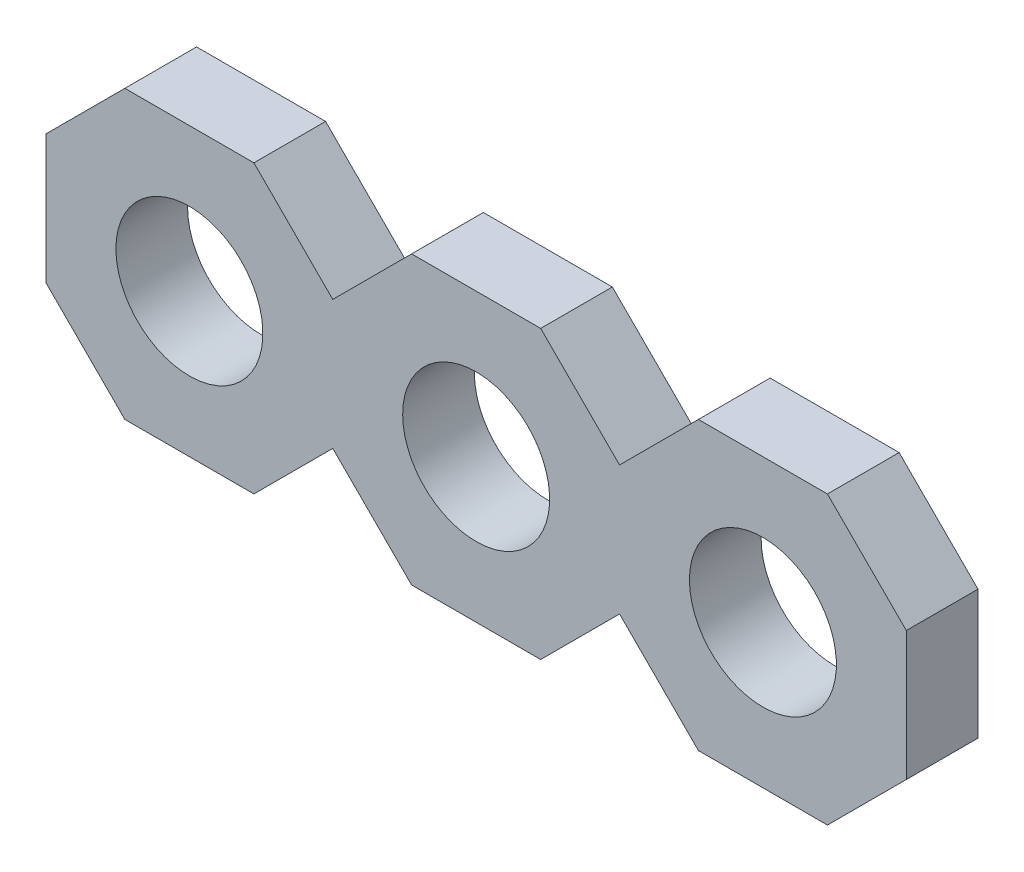
ISO-10303-21;
HEADER;
FILE_DESCRIPTION(('STEP AP214'),'2;1');
FILE_NAME('part.step','',(''),(''),'','','');
FILE_SCHEMA(('AUTOMOTIVE_DESIGN { 1 0 10303 214 1 1 1 1 }'));
ENDSEC;
DATA;
#1=APPLICATION_CONTEXT('core data for automotive mechanical design processes');
#2=APPLICATION_PROTOCOL_DEFINITION('international standard','automotive_design',2000,#1);
#3=PRODUCT_CONTEXT('',#1,'mechanical');
#4=PRODUCT('Part','Part','',(#3));
#5=PRODUCT_RELATED_PRODUCT_CATEGORY('part','',(#4));
#6=PRODUCT_DEFINITION_FORMATION('','',#4);
#7=PRODUCT_DEFINITION_CONTEXT('part definition',#1,'design');
#8=PRODUCT_DEFINITION('design','',#6,#7);
#9=PRODUCT_DEFINITION_SHAPE('','',#8);
#10=(LENGTH_UNIT() NAMED_UNIT(*) SI_UNIT(.MILLI.,.METRE.));
#11=(NAMED_UNIT(*) PLANE_ANGLE_UNIT() SI_UNIT($,.RADIAN.));
#12=(NAMED_UNIT(*) SI_UNIT($,.STERADIAN.) SOLID_ANGLE_UNIT());
#13=UNCERTAINTY_MEASURE_WITH_UNIT(LENGTH_MEASURE(1.E-05),#10,'distance_accuracy_value','');
#14=(GEOMETRIC_REPRESENTATION_CONTEXT(3) GLOBAL_UNCERTAINTY_ASSIGNED_CONTEXT((#13)) GLOBAL_UNIT_ASSIGNED_CONTEXT((#10,
#11,#12)) REPRESENTATION_CONTEXT('',''));
#15=CARTESIAN_POINT('',(0.,0.,0.));
#16=DIRECTION('',(0.,0.,1.));
#17=DIRECTION('',(1.,0.,0.));
#18=AXIS2_PLACEMENT_3D('',#15,#16,#17);
#19=CARTESIAN_POINT('',(0.,0.,0.));
#20=DIRECTION('',(0.,0.,-1.));
#21=DIRECTION('',(-1.,0.,0.));
#22=AXIS2_PLACEMENT_3D('',#19,#20,#21);
#23=PLANE('',#22);
#24=CARTESIAN_POINT('',(-16.,0.,0.));
#25=DIRECTION('',(0.,0.,-1.));
#26=DIRECTION('',(-1.,0.,0.));
#27=AXIS2_PLACEMENT_3D('',#24,#25,#26);
#28=CIRCLE('',#27,2.05);
#29=CARTESIAN_POINT('',(-18.05,0.,0.));
#30=VERTEX_POINT('',#29);
#31=EDGE_CURVE('E182',#30,#30,#28,.F.);
#32=ORIENTED_EDGE('',*,*,#31,.T.);
#33=EDGE_LOOP('',(#32));
#34=FACE_BOUND('',#33,.T.);
#35=CARTESIAN_POINT('',(-8.,0.,0.));
#36=DIRECTION('',(0.,0.,-1.));
#37=DIRECTION('',(-1.,0.,0.));
#38=AXIS2_PLACEMENT_3D('',#35,#36,#37);
#39=CIRCLE('',#38,2.05);
#40=CARTESIAN_POINT('',(-10.05,0.,0.));
#41=VERTEX_POINT('',#40);
#42=EDGE_CURVE('E184',#41,#41,#39,.F.);
#43=ORIENTED_EDGE('',*,*,#42,.T.);
#44=EDGE_LOOP('',(#43));
#45=FACE_BOUND('',#44,.T.);
#46=CARTESIAN_POINT('',(0.,0.,0.));
#47=DIRECTION('',(0.,0.,-1.));
#48=DIRECTION('',(-1.,0.,0.));
#49=AXIS2_PLACEMENT_3D('',#46,#47,#48);
#50=CIRCLE('',#49,2.05);
#51=CARTESIAN_POINT('',(-2.05,0.,0.));
#52=VERTEX_POINT('',#51);
#53=EDGE_CURVE('E20',#52,#52,#50,.F.);
#54=ORIENTED_EDGE('',*,*,#53,.T.);
#55=EDGE_LOOP('',(#54));
#56=FACE_BOUND('',#55,.T.);
#57=DIRECTION('',(0.707106781186548,-0.707106781186548,0.));
#58=VECTOR('',#57,1.);
#59=CARTESIAN_POINT('',(-6.2,4.,0.));
#60=LINE('',#59,#58);
#61=CARTESIAN_POINT('',(-6.2,4.,0.));
#62=VERTEX_POINT('',#61);
#63=CARTESIAN_POINT('',(-4.,1.8,0.));
#64=VERTEX_POINT('',#63);
#65=EDGE_CURVE('E203',#62,#64,#60,.T.);
#66=ORIENTED_EDGE('',*,*,#65,.T.);
#67=DIRECTION('',(0.707106781186548,0.707106781186548,0.));
#68=VECTOR('',#67,1.);
#69=CARTESIAN_POINT('',(-4.,1.8,0.));
#70=LINE('',#69,#68);
#71=CARTESIAN_POINT('',(-1.8,4.,0.));
#72=VERTEX_POINT('',#71);
#73=EDGE_CURVE('E198',#64,#72,#70,.T.);
#74=ORIENTED_EDGE('',*,*,#73,.T.);
#75=DIRECTION('',(1.,0.,0.));
#76=VECTOR('',#75,1.);
#77=CARTESIAN_POINT('',(-1.8,4.,0.));
#78=LINE('',#77,#76);
#79=CARTESIAN_POINT('',(1.8,4.,0.));
#80=VERTEX_POINT('',#79);
#81=EDGE_CURVE('E156',#72,#80,#78,.T.);
#82=ORIENTED_EDGE('',*,*,#81,.T.);
#83=DIRECTION('',(0.707106781186548,-0.707106781186548,0.));
#84=VECTOR('',#83,1.);
#85=CARTESIAN_POINT('',(1.8,4.,0.));
#86=LINE('',#85,#84);
#87=CARTESIAN_POINT('',(4.,1.8,0.));
#88=VERTEX_POINT('',#87);
#89=EDGE_CURVE('E155',#80,#88,#86,.T.);
#90=ORIENTED_EDGE('',*,*,#89,.T.);
#91=DIRECTION('',(0.,-1.,0.));
#92=VECTOR('',#91,1.);
#93=CARTESIAN_POINT('',(4.,1.8,0.));
#94=LINE('',#93,#92);
#95=CARTESIAN_POINT('',(4.,-1.8,0.));
#96=VERTEX_POINT('',#95);
#97=EDGE_CURVE('E152',#88,#96,#94,.T.);
#98=ORIENTED_EDGE('',*,*,#97,.T.);
#99=DIRECTION('',(-0.707106781186548,-0.707106781186548,0.));
#100=VECTOR('',#99,1.);
#101=CARTESIAN_POINT('',(4.,-1.8,0.));
#102=LINE('',#101,#100);
#103=CARTESIAN_POINT('',(1.8,-4.,0.));
#104=VERTEX_POINT('',#103);
#105=EDGE_CURVE('E278',#96,#104,#102,.T.);
#106=ORIENTED_EDGE('',*,*,#105,.T.);
#107=DIRECTION('',(1.,0.,0.));
#108=VECTOR('',#107,1.);
#109=CARTESIAN_POINT('',(-1.8,-4.,0.));
#110=LINE('',#109,#108);
#111=CARTESIAN_POINT('',(-1.8,-4.,0.));
#112=VERTEX_POINT('',#111);
#113=EDGE_CURVE('E273',#104,#112,#110,.F.);
#114=ORIENTED_EDGE('',*,*,#113,.T.);
#115=DIRECTION('',(-0.707106781186548,0.707106781186548,0.));
#116=VECTOR('',#115,1.);
#117=CARTESIAN_POINT('',(-4.,-1.8,0.));
#118=LINE('',#117,#116);
#119=CARTESIAN_POINT('',(-4.,-1.8,0.));
#120=VERTEX_POINT('',#119);
#121=EDGE_CURVE('E268',#112,#120,#118,.T.);
#122=ORIENTED_EDGE('',*,*,#121,.T.);
#123=DIRECTION('',(-0.707106781186548,-0.707106781186548,0.));
#124=VECTOR('',#123,1.);
#125=CARTESIAN_POINT('',(-4.,-1.8,0.));
#126=LINE('',#125,#124);
#127=CARTESIAN_POINT('',(-6.2,-4.,0.));
#128=VERTEX_POINT('',#127);
#129=EDGE_CURVE('E263',#120,#128,#126,.T.);
#130=ORIENTED_EDGE('',*,*,#129,.T.);
#131=DIRECTION('',(1.,0.,0.));
#132=VECTOR('',#131,1.);
#133=CARTESIAN_POINT('',(-9.8,-4.,0.));
#134=LINE('',#133,#132);
#135=CARTESIAN_POINT('',(-9.8,-4.,0.));
#136=VERTEX_POINT('',#135);
#137=EDGE_CURVE('E258',#128,#136,#134,.F.);
#138=ORIENTED_EDGE('',*,*,#137,.T.);
#139=DIRECTION('',(-0.707106781186548,0.707106781186548,0.));
#140=VECTOR('',#139,1.);
#141=CARTESIAN_POINT('',(-12.,-1.8,0.));
#142=LINE('',#141,#140);
#143=CARTESIAN_POINT('',(-12.,-1.8,0.));
#144=VERTEX_POINT('',#143);
#145=EDGE_CURVE('E253',#136,#144,#142,.T.);
#146=ORIENTED_EDGE('',*,*,#145,.T.);
#147=DIRECTION('',(-0.707106781186548,-0.707106781186548,0.));
#148=VECTOR('',#147,1.);
#149=CARTESIAN_POINT('',(-12.,-1.8,0.));
#150=LINE('',#149,#148);
#151=CARTESIAN_POINT('',(-14.2,-4.,0.));
#152=VERTEX_POINT('',#151);
#153=EDGE_CURVE('E248',#144,#152,#150,.T.);
#154=ORIENTED_EDGE('',*,*,#153,.T.);
#155=DIRECTION('',(1.,0.,0.));
#156=VECTOR('',#155,1.);
#157=CARTESIAN_POINT('',(-17.8,-4.,0.));
#158=LINE('',#157,#156);
#159=CARTESIAN_POINT('',(-17.8,-4.,0.));
#160=VERTEX_POINT('',#159);
#161=EDGE_CURVE('E243',#152,#160,#158,.F.);
#162=ORIENTED_EDGE('',*,*,#161,.T.);
#163=DIRECTION('',(-0.707106781186548,0.707106781186548,0.));
#164=VECTOR('',#163,1.);
#165=CARTESIAN_POINT('',(-20.,-1.8,0.));
#166=LINE('',#165,#164);
#167=CARTESIAN_POINT('',(-20.,-1.8,0.));
#168=VERTEX_POINT('',#167);
#169=EDGE_CURVE('E238',#160,#168,#166,.T.);
#170=ORIENTED_EDGE('',*,*,#169,.T.);
#171=DIRECTION('',(0.,1.,0.));
#172=VECTOR('',#171,1.);
#173=CARTESIAN_POINT('',(-20.,1.8,0.));
#174=LINE('',#173,#172);
#175=CARTESIAN_POINT('',(-20.,1.8,0.));
#176=VERTEX_POINT('',#175);
#177=EDGE_CURVE('E233',#168,#176,#174,.T.);
#178=ORIENTED_EDGE('',*,*,#177,.T.);
#179=DIRECTION('',(0.707106781186548,0.707106781186548,0.));
#180=VECTOR('',#179,1.);
#181=CARTESIAN_POINT('',(-20.,1.8,0.));
#182=LINE('',#181,#180);
#183=CARTESIAN_POINT('',(-17.8,4.,0.));
#184=VERTEX_POINT('',#183);
#185=EDGE_CURVE('E228',#176,#184,#182,.T.);
#186=ORIENTED_EDGE('',*,*,#185,.T.);
#187=DIRECTION('',(1.,0.,0.));
#188=VECTOR('',#187,1.);
#189=CARTESIAN_POINT('',(-17.8,4.,0.));
#190=LINE('',#189,#188);
#191=CARTESIAN_POINT('',(-14.2,4.,0.));
#192=VERTEX_POINT('',#191);
#193=EDGE_CURVE('E223',#184,#192,#190,.T.);
#194=ORIENTED_EDGE('',*,*,#193,.T.);
#195=DIRECTION('',(0.707106781186548,-0.707106781186548,0.));
#196=VECTOR('',#195,1.);
#197=CARTESIAN_POINT('',(-14.2,4.,0.));
#198=LINE('',#197,#196);
#199=CARTESIAN_POINT('',(-12.,1.8,0.));
#200=VERTEX_POINT('',#199);
#201=EDGE_CURVE('E218',#192,#200,#198,.T.);
#202=ORIENTED_EDGE('',*,*,#201,.T.);
#203=DIRECTION('',(0.707106781186548,0.707106781186548,0.));
#204=VECTOR('',#203,1.);
#205=CARTESIAN_POINT('',(-12.,1.8,0.));
#206=LINE('',#205,#204);
#207=CARTESIAN_POINT('',(-9.8,4.,0.));
#208=VERTEX_POINT('',#207);
#209=EDGE_CURVE('E213',#200,#208,#206,.T.);
#210=ORIENTED_EDGE('',*,*,#209,.T.);
#211=DIRECTION('',(1.,0.,0.));
#212=VECTOR('',#211,1.);
#213=CARTESIAN_POINT('',(-9.8,4.,0.));
#214=LINE('',#213,#212);
#215=EDGE_CURVE('E208',#208,#62,#214,.T.);
#216=ORIENTED_EDGE('',*,*,#215,.T.);
#217=EDGE_LOOP('',(#66,#74,#82,#90,#98,#106,#114,#122,#130,#138,#146,#154,#162,#170,#178,#186,
#194,#202,#210,#216));
#218=FACE_BOUND('',#217,.T.);
#219=ADVANCED_FACE('F17',(#34,#45,#56,#218),#23,.T.);
#220=CARTESIAN_POINT('',(1.8,4.,2.));
#221=DIRECTION('',(-0.707106781186548,-0.707106781186548,0.));
#222=DIRECTION('',(0.707106781186548,-0.707106781186548,0.));
#223=AXIS2_PLACEMENT_3D('',#220,#221,#222);
#224=PLANE('',#223);
#225=DIRECTION('',(0.,0.,-1.));
#226=VECTOR('',#225,1.);
#227=CARTESIAN_POINT('',(1.8,4.,2.));
#228=LINE('',#227,#226);
#229=CARTESIAN_POINT('',(1.8,4.,2.));
#230=VERTEX_POINT('',#229);
#231=EDGE_CURVE('E192',#80,#230,#228,.F.);
#232=ORIENTED_EDGE('',*,*,#231,.T.);
#233=DIRECTION('',(0.707106781186548,-0.707106781186547,0.));
#234=VECTOR('',#233,1.);
#235=CARTESIAN_POINT('',(1.8,4.,2.));
#236=LINE('',#235,#234);
#237=CARTESIAN_POINT('',(4.,1.8,2.));
#238=VERTEX_POINT('',#237);
#239=EDGE_CURVE('E172',#230,#238,#236,.T.);
#240=ORIENTED_EDGE('',*,*,#239,.T.);
#241=DIRECTION('',(0.,0.,1.));
#242=VECTOR('',#241,1.);
#243=CARTESIAN_POINT('',(4.,1.8,2.));
#244=LINE('',#243,#242);
#245=EDGE_CURVE('E161',#238,#88,#244,.F.);
#246=ORIENTED_EDGE('',*,*,#245,.T.);
#247=ORIENTED_EDGE('',*,*,#89,.F.);
#248=EDGE_LOOP('',(#232,#240,#246,#247));
#249=FACE_BOUND('',#248,.T.);
#250=ADVANCED_FACE('F171',(#249),#224,.F.);
#251=CARTESIAN_POINT('',(4.,1.8,2.));
#252=DIRECTION('',(-1.,0.,0.));
#253=DIRECTION('',(0.,-1.,0.));
#254=AXIS2_PLACEMENT_3D('',#251,#252,#253);
#255=PLANE('',#254);
#256=ORIENTED_EDGE('',*,*,#245,.F.);
#257=DIRECTION('',(0.,1.,0.));
#258=VECTOR('',#257,1.);
#259=CARTESIAN_POINT('',(4.,0.,2.));
#260=LINE('',#259,#258);
#261=CARTESIAN_POINT('',(4.,-1.8,2.));
#262=VERTEX_POINT('',#261);
#263=EDGE_CURVE('E292',#238,#262,#260,.F.);
#264=ORIENTED_EDGE('',*,*,#263,.T.);
#265=DIRECTION('',(0.,0.,1.));
#266=VECTOR('',#265,1.);
#267=CARTESIAN_POINT('',(4.,-1.8,2.));
#268=LINE('',#267,#266);
#269=EDGE_CURVE('E168',#262,#96,#268,.F.);
#270=ORIENTED_EDGE('',*,*,#269,.T.);
#271=ORIENTED_EDGE('',*,*,#97,.F.);
#272=EDGE_LOOP('',(#256,#264,#270,#271));
#273=FACE_BOUND('',#272,.T.);
#274=ADVANCED_FACE('F165',(#273),#255,.F.);
#275=CARTESIAN_POINT('',(4.,-1.8,2.));
#276=DIRECTION('',(-0.707106781186548,0.707106781186548,0.));
#277=DIRECTION('',(-0.707106781186548,-0.707106781186548,0.));
#278=AXIS2_PLACEMENT_3D('',#275,#276,#277);
#279=PLANE('',#278);
#280=ORIENTED_EDGE('',*,*,#269,.F.);
#281=DIRECTION('',(-0.707106781186548,-0.707106781186547,0.));
#282=VECTOR('',#281,1.);
#283=CARTESIAN_POINT('',(4.,-1.8,2.));
#284=LINE('',#283,#282);
#285=CARTESIAN_POINT('',(1.8,-4.,2.));
#286=VERTEX_POINT('',#285);
#287=EDGE_CURVE('E289',#262,#286,#284,.T.);
#288=ORIENTED_EDGE('',*,*,#287,.T.);
#289=DIRECTION('',(0.,0.,1.));
#290=VECTOR('',#289,1.);
#291=CARTESIAN_POINT('',(1.8,-4.,2.));
#292=LINE('',#291,#290);
#293=EDGE_CURVE('E275',#286,#104,#292,.F.);
#294=ORIENTED_EDGE('',*,*,#293,.T.);
#295=ORIENTED_EDGE('',*,*,#105,.F.);
#296=EDGE_LOOP('',(#280,#288,#294,#295));
#297=FACE_BOUND('',#296,.T.);
#298=ADVANCED_FACE('F287',(#297),#279,.F.);
#299=CARTESIAN_POINT('',(-1.8,-4.,2.));
#300=DIRECTION('',(0.,1.,0.));
#301=DIRECTION('',(0.,0.,1.));
#302=AXIS2_PLACEMENT_3D('',#299,#300,#301);
#303=PLANE('',#302);
#304=ORIENTED_EDGE('',*,*,#293,.F.);
#305=DIRECTION('',(-1.,0.,0.));
#306=VECTOR('',#305,1.);
#307=CARTESIAN_POINT('',(0.,-4.,2.));
#308=LINE('',#307,#306);
#309=CARTESIAN_POINT('',(-1.8,-4.,2.));
#310=VERTEX_POINT('',#309);
#311=EDGE_CURVE('E291',#286,#310,#308,.T.);
#312=ORIENTED_EDGE('',*,*,#311,.T.);
#313=DIRECTION('',(0.,0.,1.));
#314=VECTOR('',#313,1.);
#315=CARTESIAN_POINT('',(-1.8,-4.,2.));
#316=LINE('',#315,#314);
#317=EDGE_CURVE('E270',#310,#112,#316,.F.);
#318=ORIENTED_EDGE('',*,*,#317,.T.);
#319=ORIENTED_EDGE('',*,*,#113,.F.);
#320=EDGE_LOOP('',(#304,#312,#318,#319));
#321=FACE_BOUND('',#320,.T.);
#322=ADVANCED_FACE('F283',(#321),#303,.F.);
#323=CARTESIAN_POINT('',(-4.,-1.8,2.));
#324=DIRECTION('',(0.707106781186548,0.707106781186548,0.));
#325=DIRECTION('',(-0.707106781186548,0.707106781186548,0.));
#326=AXIS2_PLACEMENT_3D('',#323,#324,#325);
#327=PLANE('',#326);
#328=ORIENTED_EDGE('',*,*,#317,.F.);
#329=DIRECTION('',(-0.707106781186548,0.707106781186547,0.));
#330=VECTOR('',#329,1.);
#331=CARTESIAN_POINT('',(-1.8,-4.,2.));
#332=LINE('',#331,#330);
#333=CARTESIAN_POINT('',(-4.,-1.8,2.));
#334=VERTEX_POINT('',#333);
#335=EDGE_CURVE('E294',#310,#334,#332,.T.);
#336=ORIENTED_EDGE('',*,*,#335,.T.);
#337=DIRECTION('',(0.,0.,1.));
#338=VECTOR('',#337,1.);
#339=CARTESIAN_POINT('',(-4.,-1.8,2.));
#340=LINE('',#339,#338);
#341=EDGE_CURVE('E265',#334,#120,#340,.F.);
#342=ORIENTED_EDGE('',*,*,#341,.T.);
#343=ORIENTED_EDGE('',*,*,#121,.F.);
#344=EDGE_LOOP('',(#328,#336,#342,#343));
#345=FACE_BOUND('',#344,.T.);
#346=ADVANCED_FACE('F401',(#345),#327,.F.);
#347=CARTESIAN_POINT('',(-4.,-1.8,2.));
#348=DIRECTION('',(-0.707106781186548,0.707106781186548,0.));
#349=DIRECTION('',(-0.707106781186548,-0.707106781186548,0.));
#350=AXIS2_PLACEMENT_3D('',#347,#348,#349);
#351=PLANE('',#350);
#352=ORIENTED_EDGE('',*,*,#341,.F.);
#353=DIRECTION('',(-0.707106781186548,-0.707106781186547,0.));
#354=VECTOR('',#353,1.);
#355=CARTESIAN_POINT('',(-4.,-1.8,2.));
#356=LINE('',#355,#354);
#357=CARTESIAN_POINT('',(-6.2,-4.,2.));
#358=VERTEX_POINT('',#357);
#359=EDGE_CURVE('E299',#334,#358,#356,.T.);
#360=ORIENTED_EDGE('',*,*,#359,.T.);
#361=DIRECTION('',(0.,0.,1.));
#362=VECTOR('',#361,1.);
#363=CARTESIAN_POINT('',(-6.2,-4.,2.));
#364=LINE('',#363,#362);
#365=EDGE_CURVE('E260',#358,#128,#364,.F.);
#366=ORIENTED_EDGE('',*,*,#365,.T.);
#367=ORIENTED_EDGE('',*,*,#129,.F.);
#368=EDGE_LOOP('',(#352,#360,#366,#367));
#369=FACE_BOUND('',#368,.T.);
#370=ADVANCED_FACE('F398',(#369),#351,.F.);
#371=CARTESIAN_POINT('',(-9.8,-4.,2.));
#372=DIRECTION('',(0.,1.,0.));
#373=DIRECTION('',(0.,0.,1.));
#374=AXIS2_PLACEMENT_3D('',#371,#372,#373);
#375=PLANE('',#374);
#376=ORIENTED_EDGE('',*,*,#365,.F.);
#377=DIRECTION('',(-1.,0.,0.));
#378=VECTOR('',#377,1.);
#379=CARTESIAN_POINT('',(0.,-4.,2.));
#380=LINE('',#379,#378);
#381=CARTESIAN_POINT('',(-9.8,-4.,2.));
#382=VERTEX_POINT('',#381);
#383=EDGE_CURVE('E302',#358,#382,#380,.T.);
#384=ORIENTED_EDGE('',*,*,#383,.T.);
#385=DIRECTION('',(0.,0.,1.));
#386=VECTOR('',#385,1.);
#387=CARTESIAN_POINT('',(-9.8,-4.,2.));
#388=LINE('',#387,#386);
#389=EDGE_CURVE('E255',#382,#136,#388,.F.);
#390=ORIENTED_EDGE('',*,*,#389,.T.);
#391=ORIENTED_EDGE('',*,*,#137,.F.);
#392=EDGE_LOOP('',(#376,#384,#390,#391));
#393=FACE_BOUND('',#392,.T.);
#394=ADVANCED_FACE('F394',(#393),#375,.F.);
#395=CARTESIAN_POINT('',(-12.,-1.8,2.));
#396=DIRECTION('',(0.707106781186548,0.707106781186548,0.));
#397=DIRECTION('',(-0.707106781186548,0.707106781186548,0.));
#398=AXIS2_PLACEMENT_3D('',#395,#396,#397);
#399=PLANE('',#398);
#400=ORIENTED_EDGE('',*,*,#389,.F.);
#401=DIRECTION('',(-0.707106781186547,0.707106781186548,0.));
#402=VECTOR('',#401,1.);
#403=CARTESIAN_POINT('',(-9.8,-4.,2.));
#404=LINE('',#403,#402);
#405=CARTESIAN_POINT('',(-12.,-1.8,2.));
#406=VERTEX_POINT('',#405);
#407=EDGE_CURVE('E305',#382,#406,#404,.T.);
#408=ORIENTED_EDGE('',*,*,#407,.T.);
#409=DIRECTION('',(0.,0.,1.));
#410=VECTOR('',#409,1.);
#411=CARTESIAN_POINT('',(-12.,-1.8,2.));
#412=LINE('',#411,#410);
#413=EDGE_CURVE('E250',#406,#144,#412,.F.);
#414=ORIENTED_EDGE('',*,*,#413,.T.);
#415=ORIENTED_EDGE('',*,*,#145,.F.);
#416=EDGE_LOOP('',(#400,#408,#414,#415));
#417=FACE_BOUND('',#416,.T.);
#418=ADVANCED_FACE('F390',(#417),#399,.F.);
#419=CARTESIAN_POINT('',(-12.,-1.8,2.));
#420=DIRECTION('',(-0.707106781186548,0.707106781186548,0.));
#421=DIRECTION('',(-0.707106781186548,-0.707106781186548,0.));
#422=AXIS2_PLACEMENT_3D('',#419,#420,#421);
#423=PLANE('',#422);
#424=ORIENTED_EDGE('',*,*,#413,.F.);
#425=DIRECTION('',(-0.707106781186548,-0.707106781186547,0.));
#426=VECTOR('',#425,1.);
#427=CARTESIAN_POINT('',(-12.,-1.8,2.));
#428=LINE('',#427,#426);
#429=CARTESIAN_POINT('',(-14.2,-4.,2.));
#430=VERTEX_POINT('',#429);
#431=EDGE_CURVE('E308',#406,#430,#428,.T.);
#432=ORIENTED_EDGE('',*,*,#431,.T.);
#433=DIRECTION('',(0.,0.,1.));
#434=VECTOR('',#433,1.);
#435=CARTESIAN_POINT('',(-14.2,-4.,2.));
#436=LINE('',#435,#434);
#437=EDGE_CURVE('E245',#430,#152,#436,.F.);
#438=ORIENTED_EDGE('',*,*,#437,.T.);
#439=ORIENTED_EDGE('',*,*,#153,.F.);
#440=EDGE_LOOP('',(#424,#432,#438,#439));
#441=FACE_BOUND('',#440,.T.);
#442=ADVANCED_FACE('F386',(#441),#423,.F.);
#443=CARTESIAN_POINT('',(-17.8,-4.,2.));
#444=DIRECTION('',(0.,1.,0.));
#445=DIRECTION('',(0.,0.,1.));
#446=AXIS2_PLACEMENT_3D('',#443,#444,#445);
#447=PLANE('',#446);
#448=ORIENTED_EDGE('',*,*,#437,.F.);
#449=DIRECTION('',(-1.,0.,0.));
#450=VECTOR('',#449,1.);
#451=CARTESIAN_POINT('',(0.,-4.,2.));
#452=LINE('',#451,#450);
#453=CARTESIAN_POINT('',(-17.8,-4.,2.));
#454=VERTEX_POINT('',#453);
#455=EDGE_CURVE('E311',#430,#454,#452,.T.);
#456=ORIENTED_EDGE('',*,*,#455,.T.);
#457=DIRECTION('',(0.,0.,1.));
#458=VECTOR('',#457,1.);
#459=CARTESIAN_POINT('',(-17.8,-4.,2.));
#460=LINE('',#459,#458);
#461=EDGE_CURVE('E240',#454,#160,#460,.F.);
#462=ORIENTED_EDGE('',*,*,#461,.T.);
#463=ORIENTED_EDGE('',*,*,#161,.F.);
#464=EDGE_LOOP('',(#448,#456,#462,#463));
#465=FACE_BOUND('',#464,.T.);
#466=ADVANCED_FACE('F382',(#465),#447,.F.);
#467=CARTESIAN_POINT('',(-20.,-1.8,2.));
#468=DIRECTION('',(0.707106781186548,0.707106781186548,0.));
#469=DIRECTION('',(-0.707106781186548,0.707106781186548,0.));
#470=AXIS2_PLACEMENT_3D('',#467,#468,#469);
#471=PLANE('',#470);
#472=ORIENTED_EDGE('',*,*,#461,.F.);
#473=DIRECTION('',(-0.707106781186548,0.707106781186547,0.));
#474=VECTOR('',#473,1.);
#475=CARTESIAN_POINT('',(-17.8,-4.,2.));
#476=LINE('',#475,#474);
#477=CARTESIAN_POINT('',(-20.,-1.8,2.));
#478=VERTEX_POINT('',#477);
#479=EDGE_CURVE('E314',#454,#478,#476,.T.);
#480=ORIENTED_EDGE('',*,*,#479,.T.);
#481=DIRECTION('',(0.,0.,1.));
#482=VECTOR('',#481,1.);
#483=CARTESIAN_POINT('',(-20.,-1.8,2.));
#484=LINE('',#483,#482);
#485=EDGE_CURVE('E235',#478,#168,#484,.F.);
#486=ORIENTED_EDGE('',*,*,#485,.T.);
#487=ORIENTED_EDGE('',*,*,#169,.F.);
#488=EDGE_LOOP('',(#472,#480,#486,#487));
#489=FACE_BOUND('',#488,.T.);
#490=ADVANCED_FACE('F378',(#489),#471,.F.);
#491=CARTESIAN_POINT('',(-20.,1.8,2.));
#492=DIRECTION('',(1.,0.,0.));
#493=DIRECTION('',(0.,1.,0.));
#494=AXIS2_PLACEMENT_3D('',#491,#492,#493);
#495=PLANE('',#494);
#496=ORIENTED_EDGE('',*,*,#485,.F.);
#497=DIRECTION('',(0.,1.,0.));
#498=VECTOR('',#497,1.);
#499=CARTESIAN_POINT('',(-20.,0.,2.));
#500=LINE('',#499,#498);
#501=CARTESIAN_POINT('',(-20.,1.8,2.));
#502=VERTEX_POINT('',#501);
#503=EDGE_CURVE('E317',#478,#502,#500,.T.);
#504=ORIENTED_EDGE('',*,*,#503,.T.);
#505=DIRECTION('',(0.,0.,1.));
#506=VECTOR('',#505,1.);
#507=CARTESIAN_POINT('',(-20.,1.8,2.));
#508=LINE('',#507,#506);
#509=EDGE_CURVE('E230',#502,#176,#508,.F.);
#510=ORIENTED_EDGE('',*,*,#509,.T.);
#511=ORIENTED_EDGE('',*,*,#177,.F.);
#512=EDGE_LOOP('',(#496,#504,#510,#511));
#513=FACE_BOUND('',#512,.T.);
#514=ADVANCED_FACE('F374',(#513),#495,.F.);
#515=CARTESIAN_POINT('',(-20.,1.8,2.));
#516=DIRECTION('',(0.707106781186548,-0.707106781186548,0.));
#517=DIRECTION('',(0.707106781186548,0.707106781186548,0.));
#518=AXIS2_PLACEMENT_3D('',#515,#516,#517);
#519=PLANE('',#518);
#520=ORIENTED_EDGE('',*,*,#509,.F.);
#521=DIRECTION('',(0.707106781186547,0.707106781186548,0.));
#522=VECTOR('',#521,1.);
#523=CARTESIAN_POINT('',(-20.,1.8,2.));
#524=LINE('',#523,#522);
#525=CARTESIAN_POINT('',(-17.8,4.,2.));
#526=VERTEX_POINT('',#525);
#527=EDGE_CURVE('E320',#502,#526,#524,.T.);
#528=ORIENTED_EDGE('',*,*,#527,.T.);
#529=DIRECTION('',(0.,0.,-1.));
#530=VECTOR('',#529,1.);
#531=CARTESIAN_POINT('',(-17.8,4.,2.));
#532=LINE('',#531,#530);
#533=EDGE_CURVE('E225',#526,#184,#532,.T.);
#534=ORIENTED_EDGE('',*,*,#533,.T.);
#535=ORIENTED_EDGE('',*,*,#185,.F.);
#536=EDGE_LOOP('',(#520,#528,#534,#535));
#537=FACE_BOUND('',#536,.T.);
#538=ADVANCED_FACE('F370',(#537),#519,.F.);
#539=CARTESIAN_POINT('',(-17.8,4.,2.));
#540=DIRECTION('',(0.,-1.,0.));
#541=DIRECTION('',(0.,0.,-1.));
#542=AXIS2_PLACEMENT_3D('',#539,#540,#541);
#543=PLANE('',#542);
#544=ORIENTED_EDGE('',*,*,#533,.F.);
#545=DIRECTION('',(-1.,0.,0.));
#546=VECTOR('',#545,1.);
#547=CARTESIAN_POINT('',(0.,4.,2.));
#548=LINE('',#547,#546);
#549=CARTESIAN_POINT('',(-14.2,4.,2.));
#550=VERTEX_POINT('',#549);
#551=EDGE_CURVE('E323',#526,#550,#548,.F.);
#552=ORIENTED_EDGE('',*,*,#551,.T.);
#553=DIRECTION('',(0.,0.,1.));
#554=VECTOR('',#553,1.);
#555=CARTESIAN_POINT('',(-14.2,4.,2.));
#556=LINE('',#555,#554);
#557=EDGE_CURVE('E220',#550,#192,#556,.F.);
#558=ORIENTED_EDGE('',*,*,#557,.T.);
#559=ORIENTED_EDGE('',*,*,#193,.F.);
#560=EDGE_LOOP('',(#544,#552,#558,#559));
#561=FACE_BOUND('',#560,.T.);
#562=ADVANCED_FACE('F366',(#561),#543,.F.);
#563=CARTESIAN_POINT('',(-14.2,4.,2.));
#564=DIRECTION('',(-0.707106781186548,-0.707106781186548,0.));
#565=DIRECTION('',(0.707106781186548,-0.707106781186548,0.));
#566=AXIS2_PLACEMENT_3D('',#563,#564,#565);
#567=PLANE('',#566);
#568=ORIENTED_EDGE('',*,*,#557,.F.);
#569=DIRECTION('',(0.707106781186548,-0.707106781186547,0.));
#570=VECTOR('',#569,1.);
#571=CARTESIAN_POINT('',(-14.2,4.,2.));
#572=LINE('',#571,#570);
#573=CARTESIAN_POINT('',(-12.,1.8,2.));
#574=VERTEX_POINT('',#573);
#575=EDGE_CURVE('E326',#550,#574,#572,.T.);
#576=ORIENTED_EDGE('',*,*,#575,.T.);
#577=DIRECTION('',(0.,0.,1.));
#578=VECTOR('',#577,1.);
#579=CARTESIAN_POINT('',(-12.,1.8,2.));
#580=LINE('',#579,#578);
#581=EDGE_CURVE('E215',#574,#200,#580,.F.);
#582=ORIENTED_EDGE('',*,*,#581,.T.);
#583=ORIENTED_EDGE('',*,*,#201,.F.);
#584=EDGE_LOOP('',(#568,#576,#582,#583));
#585=FACE_BOUND('',#584,.T.);
#586=ADVANCED_FACE('F362',(#585),#567,.F.);
#587=CARTESIAN_POINT('',(-12.,1.8,2.));
#588=DIRECTION('',(0.707106781186548,-0.707106781186548,0.));
#589=DIRECTION('',(0.707106781186548,0.707106781186548,0.));
#590=AXIS2_PLACEMENT_3D('',#587,#588,#589);
#591=PLANE('',#590);
#592=ORIENTED_EDGE('',*,*,#581,.F.);
#593=DIRECTION('',(0.707106781186548,0.707106781186547,0.));
#594=VECTOR('',#593,1.);
#595=CARTESIAN_POINT('',(-12.,1.8,2.));
#596=LINE('',#595,#594);
#597=CARTESIAN_POINT('',(-9.8,4.,2.));
#598=VERTEX_POINT('',#597);
#599=EDGE_CURVE('E329',#574,#598,#596,.T.);
#600=ORIENTED_EDGE('',*,*,#599,.T.);
#601=DIRECTION('',(0.,0.,-1.));
#602=VECTOR('',#601,1.);
#603=CARTESIAN_POINT('',(-9.8,4.,2.));
#604=LINE('',#603,#602);
#605=EDGE_CURVE('E210',#598,#208,#604,.T.);
#606=ORIENTED_EDGE('',*,*,#605,.T.);
#607=ORIENTED_EDGE('',*,*,#209,.F.);
#608=EDGE_LOOP('',(#592,#600,#606,#607));
#609=FACE_BOUND('',#608,.T.);
#610=ADVANCED_FACE('F358',(#609),#591,.F.);
#611=CARTESIAN_POINT('',(-9.8,4.,2.));
#612=DIRECTION('',(0.,-1.,0.));
#613=DIRECTION('',(0.,0.,-1.));
#614=AXIS2_PLACEMENT_3D('',#611,#612,#613);
#615=PLANE('',#614);
#616=ORIENTED_EDGE('',*,*,#605,.F.);
#617=DIRECTION('',(-1.,0.,0.));
#618=VECTOR('',#617,1.);
#619=CARTESIAN_POINT('',(0.,4.,2.));
#620=LINE('',#619,#618);
#621=CARTESIAN_POINT('',(-6.2,4.,2.));
#622=VERTEX_POINT('',#621);
#623=EDGE_CURVE('E332',#598,#622,#620,.F.);
#624=ORIENTED_EDGE('',*,*,#623,.T.);
#625=DIRECTION('',(0.,0.,1.));
#626=VECTOR('',#625,1.);
#627=CARTESIAN_POINT('',(-6.2,4.,2.));
#628=LINE('',#627,#626);
#629=EDGE_CURVE('E205',#622,#62,#628,.F.);
#630=ORIENTED_EDGE('',*,*,#629,.T.);
#631=ORIENTED_EDGE('',*,*,#215,.F.);
#632=EDGE_LOOP('',(#616,#624,#630,#631));
#633=FACE_BOUND('',#632,.T.);
#634=ADVANCED_FACE('F354',(#633),#615,.F.);
#635=CARTESIAN_POINT('',(-6.2,4.,2.));
#636=DIRECTION('',(-0.707106781186548,-0.707106781186548,0.));
#637=DIRECTION('',(0.707106781186548,-0.707106781186548,0.));
#638=AXIS2_PLACEMENT_3D('',#635,#636,#637);
#639=PLANE('',#638);
#640=ORIENTED_EDGE('',*,*,#629,.F.);
#641=DIRECTION('',(0.707106781186548,-0.707106781186547,0.));
#642=VECTOR('',#641,1.);
#643=CARTESIAN_POINT('',(-6.2,4.,2.));
#644=LINE('',#643,#642);
#645=CARTESIAN_POINT('',(-4.,1.8,2.));
#646=VERTEX_POINT('',#645);
#647=EDGE_CURVE('E335',#622,#646,#644,.T.);
#648=ORIENTED_EDGE('',*,*,#647,.T.);
#649=DIRECTION('',(0.,0.,1.));
#650=VECTOR('',#649,1.);
#651=CARTESIAN_POINT('',(-4.,1.8,2.));
#652=LINE('',#651,#650);
#653=EDGE_CURVE('E200',#646,#64,#652,.F.);
#654=ORIENTED_EDGE('',*,*,#653,.T.);
#655=ORIENTED_EDGE('',*,*,#65,.F.);
#656=EDGE_LOOP('',(#640,#648,#654,#655));
#657=FACE_BOUND('',#656,.T.);
#658=ADVANCED_FACE('F350',(#657),#639,.F.);
#659=CARTESIAN_POINT('',(-4.,1.8,2.));
#660=DIRECTION('',(0.707106781186548,-0.707106781186548,0.));
#661=DIRECTION('',(0.707106781186548,0.707106781186548,0.));
#662=AXIS2_PLACEMENT_3D('',#659,#660,#661);
#663=PLANE('',#662);
#664=ORIENTED_EDGE('',*,*,#653,.F.);
#665=DIRECTION('',(0.707106781186548,0.707106781186547,0.));
#666=VECTOR('',#665,1.);
#667=CARTESIAN_POINT('',(-4.,1.8,2.));
#668=LINE('',#667,#666);
#669=CARTESIAN_POINT('',(-1.8,4.,2.));
#670=VERTEX_POINT('',#669);
#671=EDGE_CURVE('E338',#646,#670,#668,.T.);
#672=ORIENTED_EDGE('',*,*,#671,.T.);
#673=DIRECTION('',(0.,0.,-1.));
#674=VECTOR('',#673,1.);
#675=CARTESIAN_POINT('',(-1.8,4.,2.));
#676=LINE('',#675,#674);
#677=EDGE_CURVE('E35',#670,#72,#676,.T.);
#678=ORIENTED_EDGE('',*,*,#677,.T.);
#679=ORIENTED_EDGE('',*,*,#73,.F.);
#680=EDGE_LOOP('',(#664,#672,#678,#679));
#681=FACE_BOUND('',#680,.T.);
#682=ADVANCED_FACE('F346',(#681),#663,.F.);
#683=CARTESIAN_POINT('',(-1.8,4.,2.));
#684=DIRECTION('',(0.,-1.,0.));
#685=DIRECTION('',(0.,0.,-1.));
#686=AXIS2_PLACEMENT_3D('',#683,#684,#685);
#687=PLANE('',#686);
#688=ORIENTED_EDGE('',*,*,#677,.F.);
#689=DIRECTION('',(-1.,0.,0.));
#690=VECTOR('',#689,1.);
#691=CARTESIAN_POINT('',(0.,4.,2.));
#692=LINE('',#691,#690);
#693=EDGE_CURVE('E181',#670,#230,#692,.F.);
#694=ORIENTED_EDGE('',*,*,#693,.T.);
#695=ORIENTED_EDGE('',*,*,#231,.F.);
#696=ORIENTED_EDGE('',*,*,#81,.F.);
#697=EDGE_LOOP('',(#688,#694,#695,#696));
#698=FACE_BOUND('',#697,.T.);
#699=ADVANCED_FACE('F341',(#698),#687,.F.);
#700=CARTESIAN_POINT('',(0.,0.,2.));
#701=DIRECTION('',(0.,0.,-1.));
#702=DIRECTION('',(-1.,0.,0.));
#703=AXIS2_PLACEMENT_3D('',#700,#701,#702);
#704=CYLINDRICAL_SURFACE('',#703,2.05);
#705=ORIENTED_EDGE('',*,*,#53,.F.);
#706=EDGE_LOOP('',(#705));
#707=FACE_BOUND('',#706,.T.);
#708=CARTESIAN_POINT('',(0.,0.,2.));
#709=DIRECTION('',(0.,0.,-1.));
#710=DIRECTION('',(-1.,0.,0.));
#711=AXIS2_PLACEMENT_3D('',#708,#709,#710);
#712=CIRCLE('',#711,2.05);
#713=CARTESIAN_POINT('',(-2.05,0.,2.));
#714=VERTEX_POINT('',#713);
#715=EDGE_CURVE('E178',#714,#714,#712,.F.);
#716=ORIENTED_EDGE('',*,*,#715,.T.);
#717=EDGE_LOOP('',(#716));
#718=FACE_BOUND('',#717,.T.);
#719=ADVANCED_FACE('F426',(#707,#718),#704,.F.);
#720=CARTESIAN_POINT('',(-8.,0.,2.));
#721=DIRECTION('',(0.,0.,-1.));
#722=DIRECTION('',(-1.,0.,0.));
#723=AXIS2_PLACEMENT_3D('',#720,#721,#722);
#724=CYLINDRICAL_SURFACE('',#723,2.05);
#725=ORIENTED_EDGE('',*,*,#42,.F.);
#726=EDGE_LOOP('',(#725));
#727=FACE_BOUND('',#726,.T.);
#728=CARTESIAN_POINT('',(-8.,0.,2.));
#729=DIRECTION('',(0.,0.,-1.));
#730=DIRECTION('',(-1.,0.,0.));
#731=AXIS2_PLACEMENT_3D('',#728,#729,#730);
#732=CIRCLE('',#731,2.05);
#733=CARTESIAN_POINT('',(-10.05,0.,2.));
#734=VERTEX_POINT('',#733);
#735=EDGE_CURVE('E26',#734,#734,#732,.F.);
#736=ORIENTED_EDGE('',*,*,#735,.T.);
#737=EDGE_LOOP('',(#736));
#738=FACE_BOUND('',#737,.T.);
#739=ADVANCED_FACE('F418',(#727,#738),#724,.F.);
#740=CARTESIAN_POINT('',(-16.,0.,2.));
#741=DIRECTION('',(0.,0.,-1.));
#742=DIRECTION('',(-1.,0.,0.));
#743=AXIS2_PLACEMENT_3D('',#740,#741,#742);
#744=CYLINDRICAL_SURFACE('',#743,2.05);
#745=ORIENTED_EDGE('',*,*,#31,.F.);
#746=EDGE_LOOP('',(#745));
#747=FACE_BOUND('',#746,.T.);
#748=CARTESIAN_POINT('',(-16.,0.,2.));
#749=DIRECTION('',(0.,0.,-1.));
#750=DIRECTION('',(-1.,0.,0.));
#751=AXIS2_PLACEMENT_3D('',#748,#749,#750);
#752=CIRCLE('',#751,2.05);
#753=CARTESIAN_POINT('',(-18.05,0.,2.));
#754=VERTEX_POINT('',#753);
#755=EDGE_CURVE('E10',#754,#754,#752,.F.);
#756=ORIENTED_EDGE('',*,*,#755,.T.);
#757=EDGE_LOOP('',(#756));
#758=FACE_BOUND('',#757,.T.);
#759=ADVANCED_FACE('F412',(#747,#758),#744,.F.);
#760=CARTESIAN_POINT('',(0.,0.,2.));
#761=DIRECTION('',(0.,0.,-1.));
#762=DIRECTION('',(-1.,0.,0.));
#763=AXIS2_PLACEMENT_3D('',#760,#761,#762);
#764=PLANE('',#763);
#765=ORIENTED_EDGE('',*,*,#755,.F.);
#766=EDGE_LOOP('',(#765));
#767=FACE_BOUND('',#766,.T.);
#768=ORIENTED_EDGE('',*,*,#735,.F.);
#769=EDGE_LOOP('',(#768));
#770=FACE_BOUND('',#769,.T.);
#771=ORIENTED_EDGE('',*,*,#715,.F.);
#772=EDGE_LOOP('',(#771));
#773=FACE_BOUND('',#772,.T.);
#774=ORIENTED_EDGE('',*,*,#671,.F.);
#775=ORIENTED_EDGE('',*,*,#647,.F.);
#776=ORIENTED_EDGE('',*,*,#623,.F.);
#777=ORIENTED_EDGE('',*,*,#599,.F.);
#778=ORIENTED_EDGE('',*,*,#575,.F.);
#779=ORIENTED_EDGE('',*,*,#551,.F.);
#780=ORIENTED_EDGE('',*,*,#527,.F.);
#781=ORIENTED_EDGE('',*,*,#503,.F.);
#782=ORIENTED_EDGE('',*,*,#479,.F.);
#783=ORIENTED_EDGE('',*,*,#455,.F.);
#784=ORIENTED_EDGE('',*,*,#431,.F.);
#785=ORIENTED_EDGE('',*,*,#407,.F.);
#786=ORIENTED_EDGE('',*,*,#383,.F.);
#787=ORIENTED_EDGE('',*,*,#359,.F.);
#788=ORIENTED_EDGE('',*,*,#335,.F.);
#789=ORIENTED_EDGE('',*,*,#311,.F.);
#790=ORIENTED_EDGE('',*,*,#287,.F.);
#791=ORIENTED_EDGE('',*,*,#263,.F.);
#792=ORIENTED_EDGE('',*,*,#239,.F.);
#793=ORIENTED_EDGE('',*,*,#693,.F.);
#794=EDGE_LOOP('',(#774,#775,#776,#777,#778,#779,#780,#781,#782,#783,#784,#785,#786,#787,#788,
#789,#790,#791,#792,#793));
#795=FACE_BOUND('',#794,.T.);
#796=ADVANCED_FACE('F343',(#767,#770,#773,#795),#764,.F.);
#797=CLOSED_SHELL('',(#219,#250,#274,#298,#322,#346,#370,#394,#418,#442,#466,#490,#514,#538,
#562,#586,#610,#634,#658,#682,#699,#719,#739,#759,#796));
#798=MANIFOLD_SOLID_BREP('B1',#797);
#799=ADVANCED_BREP_SHAPE_REPRESENTATION('',(#18,#798),#14);
#800=SHAPE_DEFINITION_REPRESENTATION(#9,#799);
ENDSEC;
END-ISO-10303-21;
